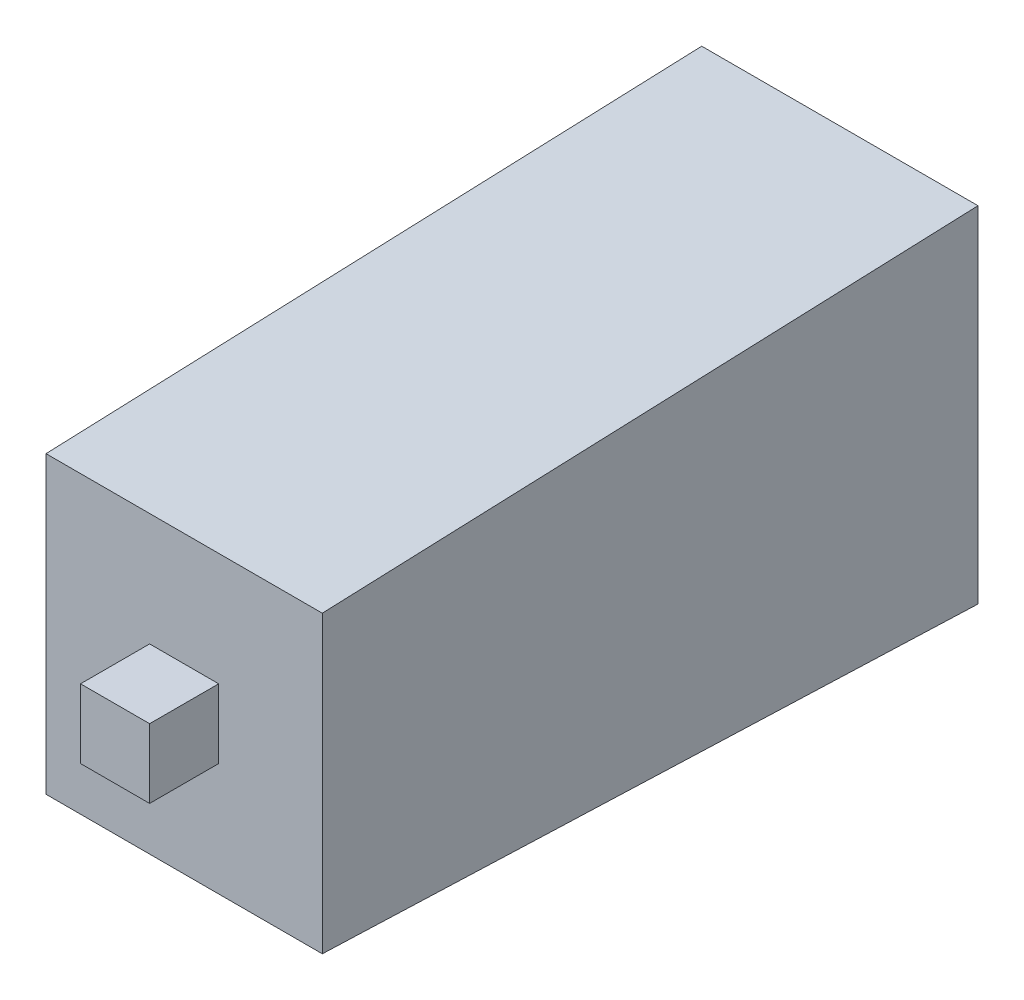
ISO-10303-21;
HEADER;
FILE_DESCRIPTION(('STEP AP214'),'2;1');
FILE_NAME('part.step','',(''),(''),'','','');
FILE_SCHEMA(('AUTOMOTIVE_DESIGN { 1 0 10303 214 1 1 1 1 }'));
ENDSEC;
DATA;
#1=APPLICATION_CONTEXT('core data for automotive mechanical design processes');
#2=APPLICATION_PROTOCOL_DEFINITION('international standard','automotive_design',2000,#1);
#3=PRODUCT_CONTEXT('',#1,'mechanical');
#4=PRODUCT('Part','Part','',(#3));
#5=PRODUCT_RELATED_PRODUCT_CATEGORY('part','',(#4));
#6=PRODUCT_DEFINITION_FORMATION('','',#4);
#7=PRODUCT_DEFINITION_CONTEXT('part definition',#1,'design');
#8=PRODUCT_DEFINITION('design','',#6,#7);
#9=PRODUCT_DEFINITION_SHAPE('','',#8);
#10=(LENGTH_UNIT() NAMED_UNIT(*) SI_UNIT(.MILLI.,.METRE.));
#11=(NAMED_UNIT(*) PLANE_ANGLE_UNIT() SI_UNIT($,.RADIAN.));
#12=(NAMED_UNIT(*) SI_UNIT($,.STERADIAN.) SOLID_ANGLE_UNIT());
#13=UNCERTAINTY_MEASURE_WITH_UNIT(LENGTH_MEASURE(1.E-05),#10,'distance_accuracy_value','');
#14=(GEOMETRIC_REPRESENTATION_CONTEXT(3) GLOBAL_UNCERTAINTY_ASSIGNED_CONTEXT((#13)) GLOBAL_UNIT_ASSIGNED_CONTEXT((#10,
#11,#12)) REPRESENTATION_CONTEXT('',''));
#15=CARTESIAN_POINT('',(0.,0.,0.));
#16=DIRECTION('',(0.,0.,1.));
#17=DIRECTION('',(1.,0.,0.));
#18=AXIS2_PLACEMENT_3D('',#15,#16,#17);
#19=CARTESIAN_POINT('',(45.6887702745492,31.6424845178765,50.));
#20=DIRECTION('',(0.,0.,1.));
#21=DIRECTION('',(1.,0.,0.));
#22=AXIS2_PLACEMENT_3D('',#19,#20,#21);
#23=PLANE('',#22);
#24=DIRECTION('',(-1.,0.,0.));
#25=VECTOR('',#24,1.);
#26=CARTESIAN_POINT('',(15.7387702745493,-28.3494854676777,50.));
#27=LINE('',#26,#25);
#28=CARTESIAN_POINT('',(15.7387702745493,-28.3494854676777,50.));
#29=VERTEX_POINT('',#28);
#30=CARTESIAN_POINT('',(-4.36122972545079,-28.3494854676777,50.));
#31=VERTEX_POINT('',#30);
#32=EDGE_CURVE('E168',#29,#31,#27,.T.);
#33=ORIENTED_EDGE('',*,*,#32,.F.);
#34=DIRECTION('',(0.,-1.,0.));
#35=VECTOR('',#34,1.);
#36=CARTESIAN_POINT('',(15.7387702745492,-8.2494854676777,50.));
#37=LINE('',#36,#35);
#38=CARTESIAN_POINT('',(15.7387702745492,-8.2494854676777,50.));
#39=VERTEX_POINT('',#38);
#40=EDGE_CURVE('E58',#39,#29,#37,.T.);
#41=ORIENTED_EDGE('',*,*,#40,.F.);
#42=DIRECTION('',(1.,0.,0.));
#43=VECTOR('',#42,1.);
#44=CARTESIAN_POINT('',(15.7387702745492,-8.2494854676777,50.));
#45=LINE('',#44,#43);
#46=CARTESIAN_POINT('',(-4.36122972545079,-8.2494854676777,50.));
#47=VERTEX_POINT('',#46);
#48=EDGE_CURVE('E155',#47,#39,#45,.T.);
#49=ORIENTED_EDGE('',*,*,#48,.F.);
#50=DIRECTION('',(0.,1.,0.));
#51=VECTOR('',#50,1.);
#52=CARTESIAN_POINT('',(-4.36122972545079,-8.2494854676777,50.));
#53=LINE('',#52,#51);
#54=EDGE_CURVE('E159',#31,#47,#53,.T.);
#55=ORIENTED_EDGE('',*,*,#54,.F.);
#56=EDGE_LOOP('',(#33,#41,#49,#55));
#57=FACE_BOUND('',#56,.T.);
#58=DIRECTION('',(-1.,0.,0.));
#59=VECTOR('',#58,1.);
#60=CARTESIAN_POINT('',(0.,-68.2414554532319,50.));
#61=LINE('',#60,#59);
#62=CARTESIAN_POINT('',(45.6887702745492,-68.2414554532319,50.));
#63=VERTEX_POINT('',#62);
#64=CARTESIAN_POINT('',(-34.3112297254508,-68.2414554532319,50.));
#65=VERTEX_POINT('',#64);
#66=EDGE_CURVE('E230',#63,#65,#61,.T.);
#67=ORIENTED_EDGE('',*,*,#66,.T.);
#68=DIRECTION('',(0.,-1.,0.));
#69=VECTOR('',#68,1.);
#70=CARTESIAN_POINT('',(-34.3112297254508,-68.3575154821235,50.));
#71=LINE('',#70,#69);
#72=CARTESIAN_POINT('',(-34.3112297254508,31.6424845178765,50.));
#73=VERTEX_POINT('',#72);
#74=EDGE_CURVE('E225',#73,#65,#71,.T.);
#75=ORIENTED_EDGE('',*,*,#74,.F.);
#76=DIRECTION('',(-1.,0.,0.));
#77=VECTOR('',#76,1.);
#78=CARTESIAN_POINT('',(-34.3112297254508,31.6424845178765,50.));
#79=LINE('',#78,#77);
#80=CARTESIAN_POINT('',(45.6887702745492,31.6424845178765,50.));
#81=VERTEX_POINT('',#80);
#82=EDGE_CURVE('E229',#81,#73,#79,.T.);
#83=ORIENTED_EDGE('',*,*,#82,.F.);
#84=DIRECTION('',(0.,1.,0.));
#85=VECTOR('',#84,1.);
#86=CARTESIAN_POINT('',(45.6887702745492,31.6424845178765,50.));
#87=LINE('',#86,#85);
#88=EDGE_CURVE('E11',#63,#81,#87,.T.);
#89=ORIENTED_EDGE('',*,*,#88,.F.);
#90=EDGE_LOOP('',(#67,#75,#83,#89));
#91=FACE_BOUND('',#90,.T.);
#92=ADVANCED_FACE('F40',(#57,#91),#23,.F.);
#93=CARTESIAN_POINT('',(0.,-0.0212504665995525,239.859592583932));
#94=DIRECTION('',(0.,8.85954415549065E-05,-0.999999996075424));
#95=DIRECTION('',(0.,0.999999996075424,8.85954415549065E-05));
#96=AXIS2_PLACEMENT_3D('',#93,#94,#95);
#97=PLANE('',#96);
#98=DIRECTION('',(0.,0.999999996075424,8.85954415549065E-05));
#99=VECTOR('',#98,1.);
#100=CARTESIAN_POINT('',(-34.3112297254508,-68.3123188312692,239.853542306552));
#101=LINE('',#100,#99);
#102=CARTESIAN_POINT('',(-34.3112297254508,-61.0287528464613,239.854187597299));
#103=VERTEX_POINT('',#102);
#104=CARTESIAN_POINT('',(-34.3112297254508,24.3958526160456,239.861755827969));
#105=VERTEX_POINT('',#104);
#106=EDGE_CURVE('E241',#103,#105,#101,.T.);
#107=ORIENTED_EDGE('',*,*,#106,.F.);
#108=DIRECTION('',(1.,0.,0.));
#109=VECTOR('',#108,1.);
#110=CARTESIAN_POINT('',(-74.3112297254508,-61.0287528464613,239.854187597299));
#111=LINE('',#110,#109);
#112=CARTESIAN_POINT('',(45.6887702745492,-61.0287528464613,239.854187597299));
#113=VERTEX_POINT('',#112);
#114=EDGE_CURVE('E224',#103,#113,#111,.T.);
#115=ORIENTED_EDGE('',*,*,#114,.T.);
#116=DIRECTION('',(0.,-0.999999996075424,-8.85954415549065E-05));
#117=VECTOR('',#116,1.);
#118=CARTESIAN_POINT('',(45.6887702745492,31.6876803838156,239.862401850673));
#119=LINE('',#118,#117);
#120=CARTESIAN_POINT('',(45.6887702745492,24.3958526160456,239.861755827969));
#121=VERTEX_POINT('',#120);
#122=EDGE_CURVE('E245',#121,#113,#119,.T.);
#123=ORIENTED_EDGE('',*,*,#122,.F.);
#124=DIRECTION('',(1.,0.,0.));
#125=VECTOR('',#124,1.);
#126=CARTESIAN_POINT('',(-74.3112297254508,24.3958526160456,239.861755827969));
#127=LINE('',#126,#125);
#128=EDGE_CURVE('E234',#105,#121,#127,.T.);
#129=ORIENTED_EDGE('',*,*,#128,.F.);
#130=EDGE_LOOP('',(#107,#115,#123,#129));
#131=FACE_BOUND('',#130,.T.);
#132=DIRECTION('',(0.,-0.999999996075424,-8.85954415552614E-05));
#133=VECTOR('',#132,1.);
#134=CARTESIAN_POINT('',(-4.31122972545078,-8.31645015445363,239.85885766705));
#135=LINE('',#134,#133);
#136=CARTESIAN_POINT('',(-4.31122972545078,-8.31645015445363,239.85885766705));
#137=VERTEX_POINT('',#136);
#138=CARTESIAN_POINT('',(-4.31122972545078,-28.3164500759621,239.857085758219));
#139=VERTEX_POINT('',#138);
#140=EDGE_CURVE('E66',#137,#139,#135,.T.);
#141=ORIENTED_EDGE('',*,*,#140,.F.);
#142=DIRECTION('',(1.,0.,0.));
#143=VECTOR('',#142,1.);
#144=CARTESIAN_POINT('',(-4.31122972545078,-8.31645015445363,239.85885766705));
#145=LINE('',#144,#143);
#146=CARTESIAN_POINT('',(15.6887702745492,-8.31645015445363,239.85885766705));
#147=VERTEX_POINT('',#146);
#148=EDGE_CURVE('E187',#137,#147,#145,.T.);
#149=ORIENTED_EDGE('',*,*,#148,.T.);
#150=DIRECTION('',(0.,-0.999999996075424,-8.85954415552614E-05));
#151=VECTOR('',#150,1.);
#152=CARTESIAN_POINT('',(15.6887702745492,-8.31645015445363,239.85885766705));
#153=LINE('',#152,#151);
#154=CARTESIAN_POINT('',(15.6887702745492,-28.3164500759621,239.857085758219));
#155=VERTEX_POINT('',#154);
#156=EDGE_CURVE('E205',#147,#155,#153,.T.);
#157=ORIENTED_EDGE('',*,*,#156,.T.);
#158=DIRECTION('',(1.,0.,0.));
#159=VECTOR('',#158,1.);
#160=CARTESIAN_POINT('',(-4.31122972545078,-28.3164500759621,239.857085758219));
#161=LINE('',#160,#159);
#162=EDGE_CURVE('E201',#139,#155,#161,.T.);
#163=ORIENTED_EDGE('',*,*,#162,.F.);
#164=EDGE_LOOP('',(#141,#149,#157,#163));
#165=FACE_BOUND('',#164,.T.);
#166=ADVANCED_FACE('F276',(#131,#165),#97,.F.);
#167=CARTESIAN_POINT('',(-34.3112297254508,-68.3575154821235,750.));
#168=DIRECTION('',(1.,0.,0.));
#169=DIRECTION('',(0.,1.,0.));
#170=AXIS2_PLACEMENT_3D('',#167,#168,#169);
#171=PLANE('',#170);
#172=DIRECTION('',(0.,-0.0379633617237289,-0.999279131757805));
#173=VECTOR('',#172,1.);
#174=CARTESIAN_POINT('',(-34.3112297254508,-41.6864261215724,748.986745363951));
#175=LINE('',#174,#173);
#176=EDGE_CURVE('E254',#103,#65,#175,.T.);
#177=ORIENTED_EDGE('',*,*,#176,.F.);
#178=ORIENTED_EDGE('',*,*,#106,.T.);
#179=DIRECTION('',(0.,0.0381401679043731,-0.999272399094574));
#180=VECTOR('',#179,1.);
#181=CARTESIAN_POINT('',(-34.3112297254508,4.81832531852815,752.792971022926));
#182=LINE('',#181,#180);
#183=EDGE_CURVE('E44',#105,#73,#182,.T.);
#184=ORIENTED_EDGE('',*,*,#183,.T.);
#185=ORIENTED_EDGE('',*,*,#74,.T.);
#186=EDGE_LOOP('',(#177,#178,#184,#185));
#187=FACE_BOUND('',#186,.T.);
#188=ADVANCED_FACE('F262',(#187),#171,.F.);
#189=CARTESIAN_POINT('',(45.6887702745492,31.6424845178765,750.));
#190=DIRECTION('',(-1.,0.,0.));
#191=DIRECTION('',(0.,0.,1.));
#192=AXIS2_PLACEMENT_3D('',#189,#190,#191);
#193=PLANE('',#192);
#194=DIRECTION('',(0.,0.0381401679043731,-0.999272399094574));
#195=VECTOR('',#194,1.);
#196=CARTESIAN_POINT('',(45.6887702745492,33.5020759229185,1.27870518789766));
#197=LINE('',#196,#195);
#198=EDGE_CURVE('E50',#121,#81,#197,.T.);
#199=ORIENTED_EDGE('',*,*,#198,.F.);
#200=ORIENTED_EDGE('',*,*,#122,.T.);
#201=DIRECTION('',(0.,-0.0379633617237289,-0.999279131757805));
#202=VECTOR('',#201,1.);
#203=CARTESIAN_POINT('',(45.6887702745492,-70.039904475994,2.66086836421801));
#204=LINE('',#203,#202);
#205=EDGE_CURVE('E252',#113,#63,#204,.T.);
#206=ORIENTED_EDGE('',*,*,#205,.T.);
#207=ORIENTED_EDGE('',*,*,#88,.T.);
#208=EDGE_LOOP('',(#199,#200,#206,#207));
#209=FACE_BOUND('',#208,.T.);
#210=ADVANCED_FACE('F273',(#209),#193,.F.);
#211=CARTESIAN_POINT('',(-74.3112297254508,33.5020759229185,1.27870518789766));
#212=DIRECTION('',(0.,-0.999272399094574,-0.0381401679043731));
#213=DIRECTION('',(0.,0.0381401679043731,-0.999272399094574));
#214=AXIS2_PLACEMENT_3D('',#211,#212,#213);
#215=PLANE('',#214);
#216=ORIENTED_EDGE('',*,*,#183,.F.);
#217=ORIENTED_EDGE('',*,*,#128,.T.);
#218=ORIENTED_EDGE('',*,*,#198,.T.);
#219=ORIENTED_EDGE('',*,*,#82,.T.);
#220=EDGE_LOOP('',(#216,#217,#218,#219));
#221=FACE_BOUND('',#220,.T.);
#222=ADVANCED_FACE('F42',(#221),#215,.F.);
#223=CARTESIAN_POINT('',(-74.3112297254508,-70.039904475994,2.66086836421801));
#224=DIRECTION('',(0.,-0.999279131757805,0.0379633617237289));
#225=DIRECTION('',(0.,-0.0379633617237289,-0.999279131757805));
#226=AXIS2_PLACEMENT_3D('',#223,#224,#225);
#227=PLANE('',#226);
#228=ORIENTED_EDGE('',*,*,#114,.F.);
#229=ORIENTED_EDGE('',*,*,#176,.T.);
#230=ORIENTED_EDGE('',*,*,#66,.F.);
#231=ORIENTED_EDGE('',*,*,#205,.F.);
#232=EDGE_LOOP('',(#228,#229,#230,#231));
#233=FACE_BOUND('',#232,.T.);
#234=ADVANCED_FACE('F271',(#233),#227,.T.);
#235=CARTESIAN_POINT('',(-4.31122972545078,-8.31822206328473,259.858857588558));
#236=DIRECTION('',(1.,0.,0.));
#237=DIRECTION('',(0.,1.,0.));
#238=AXIS2_PLACEMENT_3D('',#235,#236,#237);
#239=PLANE('',#238);
#240=ORIENTED_EDGE('',*,*,#140,.T.);
#241=DIRECTION('',(0.,8.85954415549065E-05,-0.999999996075424));
#242=VECTOR('',#241,1.);
#243=CARTESIAN_POINT('',(-4.31122972545078,-28.3182219847932,259.857085679727));
#244=LINE('',#243,#242);
#245=CARTESIAN_POINT('',(-4.31122972545078,-28.3182219847932,259.857085679727));
#246=VERTEX_POINT('',#245);
#247=EDGE_CURVE('E220',#246,#139,#244,.T.);
#248=ORIENTED_EDGE('',*,*,#247,.F.);
#249=DIRECTION('',(0.,-0.999999996075424,-8.85954415552614E-05));
#250=VECTOR('',#249,1.);
#251=CARTESIAN_POINT('',(-4.31122972545078,-8.31822206328473,259.858857588558));
#252=LINE('',#251,#250);
#253=CARTESIAN_POINT('',(-4.31122972545078,-8.31822206328473,259.858857588558));
#254=VERTEX_POINT('',#253);
#255=EDGE_CURVE('E182',#254,#246,#252,.T.);
#256=ORIENTED_EDGE('',*,*,#255,.F.);
#257=DIRECTION('',(0.,8.85954415549065E-05,-0.999999996075424));
#258=VECTOR('',#257,1.);
#259=CARTESIAN_POINT('',(-4.31122972545078,-8.31822206328473,259.858857588558));
#260=LINE('',#259,#258);
#261=EDGE_CURVE('E198',#254,#137,#260,.T.);
#262=ORIENTED_EDGE('',*,*,#261,.T.);
#263=EDGE_LOOP('',(#240,#248,#256,#262));
#264=FACE_BOUND('',#263,.T.);
#265=ADVANCED_FACE('F291',(#264),#239,.F.);
#266=CARTESIAN_POINT('',(-4.31122972545078,-28.3182219847932,259.857085679727));
#267=DIRECTION('',(0.,0.999999996075424,8.85954415549065E-05));
#268=DIRECTION('',(0.,-8.85954415549065E-05,0.999999996075424));
#269=AXIS2_PLACEMENT_3D('',#266,#267,#268);
#270=PLANE('',#269);
#271=ORIENTED_EDGE('',*,*,#162,.T.);
#272=DIRECTION('',(0.,8.85954415549065E-05,-0.999999996075424));
#273=VECTOR('',#272,1.);
#274=CARTESIAN_POINT('',(15.6887702745492,-28.3182219847932,259.857085679727));
#275=LINE('',#274,#273);
#276=CARTESIAN_POINT('',(15.6887702745492,-28.3182219847932,259.857085679727));
#277=VERTEX_POINT('',#276);
#278=EDGE_CURVE('E216',#277,#155,#275,.T.);
#279=ORIENTED_EDGE('',*,*,#278,.F.);
#280=DIRECTION('',(1.,0.,0.));
#281=VECTOR('',#280,1.);
#282=CARTESIAN_POINT('',(-4.31122972545078,-28.3182219847932,259.857085679727));
#283=LINE('',#282,#281);
#284=EDGE_CURVE('E186',#246,#277,#283,.T.);
#285=ORIENTED_EDGE('',*,*,#284,.F.);
#286=ORIENTED_EDGE('',*,*,#247,.T.);
#287=EDGE_LOOP('',(#271,#279,#285,#286));
#288=FACE_BOUND('',#287,.T.);
#289=ADVANCED_FACE('F296',(#288),#270,.F.);
#290=CARTESIAN_POINT('',(15.6887702745492,-8.31822206328473,259.858857588558));
#291=DIRECTION('',(1.,0.,0.));
#292=DIRECTION('',(0.,1.,0.));
#293=AXIS2_PLACEMENT_3D('',#290,#291,#292);
#294=PLANE('',#293);
#295=ORIENTED_EDGE('',*,*,#156,.F.);
#296=DIRECTION('',(0.,8.85954415549065E-05,-0.999999996075424));
#297=VECTOR('',#296,1.);
#298=CARTESIAN_POINT('',(15.6887702745492,-8.31822206328473,259.858857588558));
#299=LINE('',#298,#297);
#300=CARTESIAN_POINT('',(15.6887702745492,-8.31822206328473,259.858857588558));
#301=VERTEX_POINT('',#300);
#302=EDGE_CURVE('E212',#301,#147,#299,.T.);
#303=ORIENTED_EDGE('',*,*,#302,.F.);
#304=DIRECTION('',(0.,-0.999999996075424,-8.85954415552614E-05));
#305=VECTOR('',#304,1.);
#306=CARTESIAN_POINT('',(15.6887702745492,-8.31822206328473,259.858857588558));
#307=LINE('',#306,#305);
#308=EDGE_CURVE('E190',#301,#277,#307,.T.);
#309=ORIENTED_EDGE('',*,*,#308,.T.);
#310=ORIENTED_EDGE('',*,*,#278,.T.);
#311=EDGE_LOOP('',(#295,#303,#309,#310));
#312=FACE_BOUND('',#311,.T.);
#313=ADVANCED_FACE('F352',(#312),#294,.T.);
#314=CARTESIAN_POINT('',(-4.31122972545078,-8.31822206328473,259.858857588558));
#315=DIRECTION('',(0.,0.999999996075424,8.85954415549065E-05));
#316=DIRECTION('',(0.,-8.85954415549065E-05,0.999999996075424));
#317=AXIS2_PLACEMENT_3D('',#314,#315,#316);
#318=PLANE('',#317);
#319=ORIENTED_EDGE('',*,*,#148,.F.);
#320=ORIENTED_EDGE('',*,*,#261,.F.);
#321=DIRECTION('',(1.,0.,0.));
#322=VECTOR('',#321,1.);
#323=CARTESIAN_POINT('',(-4.31122972545078,-8.31822206328473,259.858857588558));
#324=LINE('',#323,#322);
#325=EDGE_CURVE('E194',#254,#301,#324,.T.);
#326=ORIENTED_EDGE('',*,*,#325,.T.);
#327=ORIENTED_EDGE('',*,*,#302,.T.);
#328=EDGE_LOOP('',(#319,#320,#326,#327));
#329=FACE_BOUND('',#328,.T.);
#330=ADVANCED_FACE('F360',(#329),#318,.T.);
#331=CARTESIAN_POINT('',(0.,-0.0230223754307358,259.85959250544));
#332=DIRECTION('',(0.,-8.85954415552614E-05,0.999999996075424));
#333=DIRECTION('',(0.,-0.999999996075424,-8.85954415552614E-05));
#334=AXIS2_PLACEMENT_3D('',#331,#332,#333);
#335=PLANE('',#334);
#336=ORIENTED_EDGE('',*,*,#255,.T.);
#337=ORIENTED_EDGE('',*,*,#284,.T.);
#338=ORIENTED_EDGE('',*,*,#308,.F.);
#339=ORIENTED_EDGE('',*,*,#325,.F.);
#340=EDGE_LOOP('',(#336,#337,#338,#339));
#341=FACE_BOUND('',#340,.T.);
#342=ADVANCED_FACE('F368',(#341),#335,.T.);
#343=CARTESIAN_POINT('',(15.7387702745492,-8.2494854676777,70.));
#344=DIRECTION('',(1.,0.,0.));
#345=DIRECTION('',(0.,1.,0.));
#346=AXIS2_PLACEMENT_3D('',#343,#344,#345);
#347=PLANE('',#346);
#348=ORIENTED_EDGE('',*,*,#40,.T.);
#349=DIRECTION('',(0.,0.,-1.));
#350=VECTOR('',#349,1.);
#351=CARTESIAN_POINT('',(15.7387702745493,-28.3494854676777,70.));
#352=LINE('',#351,#350);
#353=CARTESIAN_POINT('',(15.7387702745493,-28.3494854676777,70.));
#354=VERTEX_POINT('',#353);
#355=EDGE_CURVE('E130',#354,#29,#352,.T.);
#356=ORIENTED_EDGE('',*,*,#355,.F.);
#357=DIRECTION('',(0.,-1.,0.));
#358=VECTOR('',#357,1.);
#359=CARTESIAN_POINT('',(15.7387702745492,-8.2494854676777,70.));
#360=LINE('',#359,#358);
#361=CARTESIAN_POINT('',(15.7387702745492,-8.2494854676777,70.));
#362=VERTEX_POINT('',#361);
#363=EDGE_CURVE('E134',#362,#354,#360,.T.);
#364=ORIENTED_EDGE('',*,*,#363,.F.);
#365=DIRECTION('',(0.,0.,-1.));
#366=VECTOR('',#365,1.);
#367=CARTESIAN_POINT('',(15.7387702745492,-8.2494854676777,70.));
#368=LINE('',#367,#366);
#369=EDGE_CURVE('E174',#362,#39,#368,.T.);
#370=ORIENTED_EDGE('',*,*,#369,.T.);
#371=EDGE_LOOP('',(#348,#356,#364,#370));
#372=FACE_BOUND('',#371,.T.);
#373=ADVANCED_FACE('F132',(#372),#347,.F.);
#374=CARTESIAN_POINT('',(15.7387702745492,-8.2494854676777,70.));
#375=DIRECTION('',(0.,1.,0.));
#376=DIRECTION('',(0.,0.,1.));
#377=AXIS2_PLACEMENT_3D('',#374,#375,#376);
#378=PLANE('',#377);
#379=ORIENTED_EDGE('',*,*,#48,.T.);
#380=ORIENTED_EDGE('',*,*,#369,.F.);
#381=DIRECTION('',(1.,0.,0.));
#382=VECTOR('',#381,1.);
#383=CARTESIAN_POINT('',(15.7387702745492,-8.2494854676777,70.));
#384=LINE('',#383,#382);
#385=CARTESIAN_POINT('',(-4.36122972545079,-8.2494854676777,70.));
#386=VERTEX_POINT('',#385);
#387=EDGE_CURVE('E141',#386,#362,#384,.T.);
#388=ORIENTED_EDGE('',*,*,#387,.F.);
#389=DIRECTION('',(0.,0.,-1.));
#390=VECTOR('',#389,1.);
#391=CARTESIAN_POINT('',(-4.36122972545079,-8.2494854676777,70.));
#392=LINE('',#391,#390);
#393=EDGE_CURVE('E177',#386,#47,#392,.T.);
#394=ORIENTED_EDGE('',*,*,#393,.T.);
#395=EDGE_LOOP('',(#379,#380,#388,#394));
#396=FACE_BOUND('',#395,.T.);
#397=ADVANCED_FACE('F381',(#396),#378,.F.);
#398=CARTESIAN_POINT('',(-4.36122972545079,-8.2494854676777,70.));
#399=DIRECTION('',(-1.,0.,0.));
#400=DIRECTION('',(0.,-1.,0.));
#401=AXIS2_PLACEMENT_3D('',#398,#399,#400);
#402=PLANE('',#401);
#403=ORIENTED_EDGE('',*,*,#54,.T.);
#404=ORIENTED_EDGE('',*,*,#393,.F.);
#405=DIRECTION('',(0.,1.,0.));
#406=VECTOR('',#405,1.);
#407=CARTESIAN_POINT('',(-4.36122972545079,-8.2494854676777,70.));
#408=LINE('',#407,#406);
#409=CARTESIAN_POINT('',(-4.36122972545079,-28.3494854676777,70.));
#410=VERTEX_POINT('',#409);
#411=EDGE_CURVE('E150',#410,#386,#408,.T.);
#412=ORIENTED_EDGE('',*,*,#411,.F.);
#413=DIRECTION('',(0.,0.,-1.));
#414=VECTOR('',#413,1.);
#415=CARTESIAN_POINT('',(-4.36122972545079,-28.3494854676777,70.));
#416=LINE('',#415,#414);
#417=EDGE_CURVE('E140',#410,#31,#416,.T.);
#418=ORIENTED_EDGE('',*,*,#417,.T.);
#419=EDGE_LOOP('',(#403,#404,#412,#418));
#420=FACE_BOUND('',#419,.T.);
#421=ADVANCED_FACE('F388',(#420),#402,.F.);
#422=CARTESIAN_POINT('',(15.7387702745493,-28.3494854676777,70.));
#423=DIRECTION('',(0.,-1.,0.));
#424=DIRECTION('',(0.,0.,-1.));
#425=AXIS2_PLACEMENT_3D('',#422,#423,#424);
#426=PLANE('',#425);
#427=ORIENTED_EDGE('',*,*,#32,.T.);
#428=ORIENTED_EDGE('',*,*,#417,.F.);
#429=DIRECTION('',(-1.,0.,0.));
#430=VECTOR('',#429,1.);
#431=CARTESIAN_POINT('',(15.7387702745493,-28.3494854676777,70.));
#432=LINE('',#431,#430);
#433=EDGE_CURVE('E144',#354,#410,#432,.T.);
#434=ORIENTED_EDGE('',*,*,#433,.F.);
#435=ORIENTED_EDGE('',*,*,#355,.T.);
#436=EDGE_LOOP('',(#427,#428,#434,#435));
#437=FACE_BOUND('',#436,.T.);
#438=ADVANCED_FACE('F145',(#437),#426,.F.);
#439=CARTESIAN_POINT('',(0.,0.,70.));
#440=DIRECTION('',(0.,0.,-1.));
#441=DIRECTION('',(-1.,0.,0.));
#442=AXIS2_PLACEMENT_3D('',#439,#440,#441);
#443=PLANE('',#442);
#444=ORIENTED_EDGE('',*,*,#363,.T.);
#445=ORIENTED_EDGE('',*,*,#433,.T.);
#446=ORIENTED_EDGE('',*,*,#411,.T.);
#447=ORIENTED_EDGE('',*,*,#387,.T.);
#448=EDGE_LOOP('',(#444,#445,#446,#447));
#449=FACE_BOUND('',#448,.T.);
#450=ADVANCED_FACE('F152',(#449),#443,.T.);
#451=CLOSED_SHELL('',(#92,#166,#188,#210,#222,#234,#265,#289,#313,#330,#342,#373,#397,#421,#438,#450));
#452=MANIFOLD_SOLID_BREP('B2',#451);
#453=ADVANCED_BREP_SHAPE_REPRESENTATION('',(#18,#452),#14);
#454=SHAPE_DEFINITION_REPRESENTATION(#9,#453);
ENDSEC;
END-ISO-10303-21;
